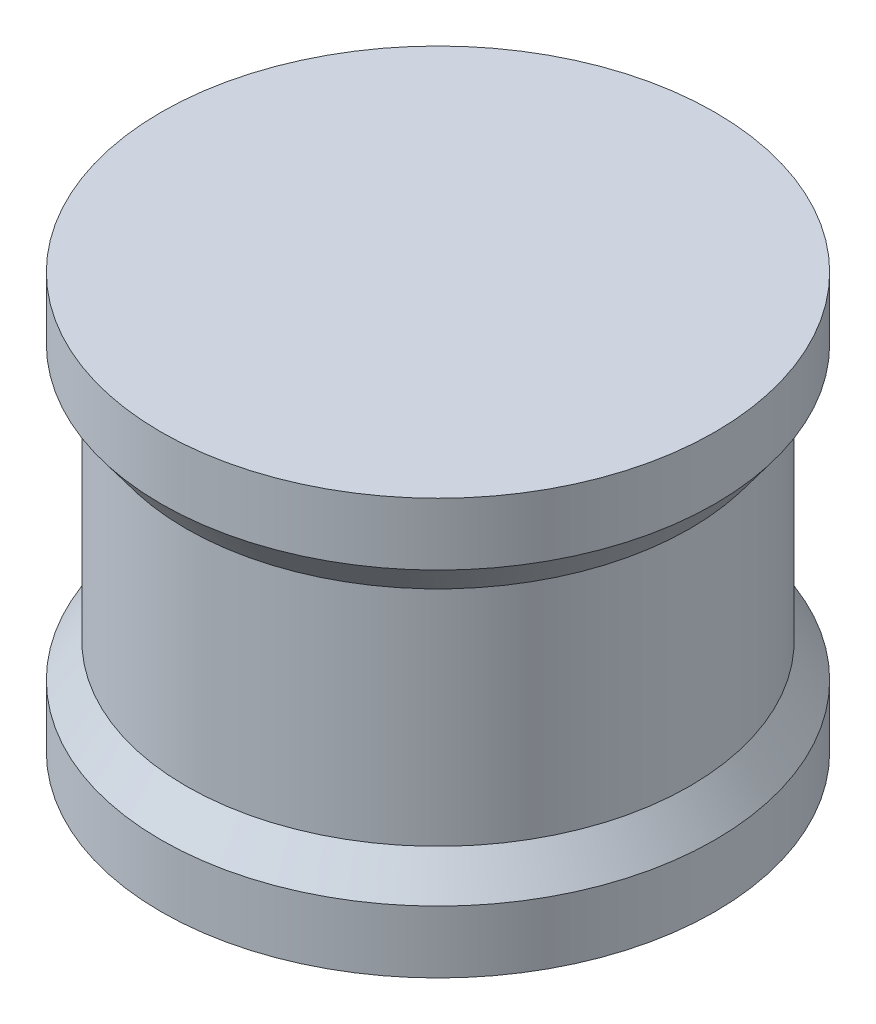
ISO-10303-21;
HEADER;
FILE_DESCRIPTION(('STEP AP214'),'2;1');
FILE_NAME('part.step','',(''),(''),'','','');
FILE_SCHEMA(('AUTOMOTIVE_DESIGN { 1 0 10303 214 1 1 1 1 }'));
ENDSEC;
DATA;
#1=APPLICATION_CONTEXT('core data for automotive mechanical design processes');
#2=APPLICATION_PROTOCOL_DEFINITION('international standard','automotive_design',2000,#1);
#3=PRODUCT_CONTEXT('',#1,'mechanical');
#4=PRODUCT('Part','Part','',(#3));
#5=PRODUCT_RELATED_PRODUCT_CATEGORY('part','',(#4));
#6=PRODUCT_DEFINITION_FORMATION('','',#4);
#7=PRODUCT_DEFINITION_CONTEXT('part definition',#1,'design');
#8=PRODUCT_DEFINITION('design','',#6,#7);
#9=PRODUCT_DEFINITION_SHAPE('','',#8);
#10=(LENGTH_UNIT() NAMED_UNIT(*) SI_UNIT(.MILLI.,.METRE.));
#11=(NAMED_UNIT(*) PLANE_ANGLE_UNIT() SI_UNIT($,.RADIAN.));
#12=(NAMED_UNIT(*) SI_UNIT($,.STERADIAN.) SOLID_ANGLE_UNIT());
#13=UNCERTAINTY_MEASURE_WITH_UNIT(LENGTH_MEASURE(1.E-05),#10,'distance_accuracy_value','');
#14=(GEOMETRIC_REPRESENTATION_CONTEXT(3) GLOBAL_UNCERTAINTY_ASSIGNED_CONTEXT((#13)) GLOBAL_UNIT_ASSIGNED_CONTEXT((#10,
#11,#12)) REPRESENTATION_CONTEXT('',''));
#15=CARTESIAN_POINT('',(0.,0.,0.));
#16=DIRECTION('',(0.,0.,1.));
#17=DIRECTION('',(1.,0.,0.));
#18=AXIS2_PLACEMENT_3D('',#15,#16,#17);
#19=CARTESIAN_POINT('',(0.,30.,0.));
#20=DIRECTION('',(0.,-1.,0.));
#21=DIRECTION('',(0.,0.,-1.));
#22=AXIS2_PLACEMENT_3D('',#19,#20,#21);
#23=CYLINDRICAL_SURFACE('',#22,20.);
#24=CARTESIAN_POINT('',(0.,4.49294523123254,0.));
#25=DIRECTION('',(0.,1.,0.));
#26=DIRECTION('',(0.,0.,1.));
#27=AXIS2_PLACEMENT_3D('',#24,#25,#26);
#28=CIRCLE('',#27,20.);
#29=CARTESIAN_POINT('',(0.,4.49294523123254,20.));
#30=VERTEX_POINT('',#29);
#31=EDGE_CURVE('E45',#30,#30,#28,.T.);
#32=ORIENTED_EDGE('',*,*,#31,.F.);
#33=EDGE_LOOP('',(#32));
#34=FACE_BOUND('',#33,.T.);
#35=CARTESIAN_POINT('',(0.,0.,0.));
#36=DIRECTION('',(0.,1.,0.));
#37=DIRECTION('',(0.,0.,1.));
#38=AXIS2_PLACEMENT_3D('',#35,#36,#37);
#39=CIRCLE('',#38,20.);
#40=CARTESIAN_POINT('',(0.,0.,20.));
#41=VERTEX_POINT('',#40);
#42=EDGE_CURVE('E38',#41,#41,#39,.T.);
#43=ORIENTED_EDGE('',*,*,#42,.T.);
#44=EDGE_LOOP('',(#43));
#45=FACE_BOUND('',#44,.T.);
#46=ADVANCED_FACE('F34',(#34,#45),#23,.T.);
#47=CARTESIAN_POINT('',(0.,0.,0.));
#48=DIRECTION('',(0.,1.,0.));
#49=DIRECTION('',(0.,0.,1.));
#50=AXIS2_PLACEMENT_3D('',#47,#48,#49);
#51=PLANE('',#50);
#52=ORIENTED_EDGE('',*,*,#42,.F.);
#53=EDGE_LOOP('',(#52));
#54=FACE_BOUND('',#53,.T.);
#55=ADVANCED_FACE('F77',(#54),#51,.F.);
#56=CARTESIAN_POINT('',(0.,4.49294523123254,0.));
#57=DIRECTION('',(0.,-1.,0.));
#58=DIRECTION('',(0.,0.,-1.));
#59=AXIS2_PLACEMENT_3D('',#56,#57,#58);
#60=CONICAL_SURFACE('',#59,20.,0.635409544931934);
#61=CARTESIAN_POINT('',(0.,6.95055760781179,0.));
#62=DIRECTION('',(0.,1.,0.));
#63=DIRECTION('',(0.,0.,1.));
#64=AXIS2_PLACEMENT_3D('',#61,#62,#63);
#65=CIRCLE('',#64,18.1876757223315);
#66=CARTESIAN_POINT('',(0.,6.95055760781179,18.1876757223315));
#67=VERTEX_POINT('',#66);
#68=EDGE_CURVE('E49',#67,#67,#65,.T.);
#69=ORIENTED_EDGE('',*,*,#68,.F.);
#70=EDGE_LOOP('',(#69));
#71=FACE_BOUND('',#70,.T.);
#72=ORIENTED_EDGE('',*,*,#31,.T.);
#73=EDGE_LOOP('',(#72));
#74=FACE_BOUND('',#73,.T.);
#75=ADVANCED_FACE('F71',(#71,#74),#60,.T.);
#76=CARTESIAN_POINT('',(0.,30.,0.));
#77=DIRECTION('',(0.,1.,0.));
#78=DIRECTION('',(0.,0.,1.));
#79=AXIS2_PLACEMENT_3D('',#76,#77,#78);
#80=CYLINDRICAL_SURFACE('',#79,18.1876757223315);
#81=CARTESIAN_POINT('',(0.,23.0494423921882,0.));
#82=DIRECTION('',(0.,1.,0.));
#83=DIRECTION('',(0.,0.,1.));
#84=AXIS2_PLACEMENT_3D('',#81,#82,#83);
#85=CIRCLE('',#84,18.1876757223315);
#86=CARTESIAN_POINT('',(0.,23.0494423921882,18.1876757223315));
#87=VERTEX_POINT('',#86);
#88=EDGE_CURVE('E52',#87,#87,#85,.T.);
#89=ORIENTED_EDGE('',*,*,#88,.F.);
#90=EDGE_LOOP('',(#89));
#91=FACE_BOUND('',#90,.T.);
#92=ORIENTED_EDGE('',*,*,#68,.T.);
#93=EDGE_LOOP('',(#92));
#94=FACE_BOUND('',#93,.T.);
#95=ADVANCED_FACE('F65',(#91,#94),#80,.T.);
#96=CARTESIAN_POINT('',(0.,23.0494423921882,0.));
#97=DIRECTION('',(0.,1.,0.));
#98=DIRECTION('',(0.,0.,1.));
#99=AXIS2_PLACEMENT_3D('',#96,#97,#98);
#100=CONICAL_SURFACE('',#99,18.1876757223315,0.635409544931934);
#101=CARTESIAN_POINT('',(0.,25.5070547687675,0.));
#102=DIRECTION('',(0.,1.,0.));
#103=DIRECTION('',(0.,0.,1.));
#104=AXIS2_PLACEMENT_3D('',#101,#102,#103);
#105=CIRCLE('',#104,20.);
#106=CARTESIAN_POINT('',(0.,25.5070547687675,20.));
#107=VERTEX_POINT('',#106);
#108=EDGE_CURVE('E55',#107,#107,#105,.T.);
#109=ORIENTED_EDGE('',*,*,#108,.F.);
#110=EDGE_LOOP('',(#109));
#111=FACE_BOUND('',#110,.T.);
#112=ORIENTED_EDGE('',*,*,#88,.T.);
#113=EDGE_LOOP('',(#112));
#114=FACE_BOUND('',#113,.T.);
#115=ADVANCED_FACE('F61',(#111,#114),#100,.T.);
#116=CARTESIAN_POINT('',(0.,30.,0.));
#117=DIRECTION('',(0.,1.,0.));
#118=DIRECTION('',(0.,0.,1.));
#119=AXIS2_PLACEMENT_3D('',#116,#117,#118);
#120=PLANE('',#119);
#121=CARTESIAN_POINT('',(0.,30.,0.));
#122=DIRECTION('',(0.,1.,0.));
#123=DIRECTION('',(0.,0.,1.));
#124=AXIS2_PLACEMENT_3D('',#121,#122,#123);
#125=CIRCLE('',#124,20.);
#126=CARTESIAN_POINT('',(0.,30.,20.));
#127=VERTEX_POINT('',#126);
#128=EDGE_CURVE('E10',#127,#127,#125,.T.);
#129=ORIENTED_EDGE('',*,*,#128,.T.);
#130=EDGE_LOOP('',(#129));
#131=FACE_BOUND('',#130,.T.);
#132=ADVANCED_FACE('F64',(#131),#120,.T.);
#133=ORIENTED_EDGE('',*,*,#108,.T.);
#134=EDGE_LOOP('',(#133));
#135=FACE_BOUND('',#134,.T.);
#136=ORIENTED_EDGE('',*,*,#128,.F.);
#137=EDGE_LOOP('',(#136));
#138=FACE_BOUND('',#137,.T.);
#139=ADVANCED_FACE('F36',(#135,#138),#23,.T.);
#140=CLOSED_SHELL('',(#46,#55,#75,#95,#115,#132,#139));
#141=MANIFOLD_SOLID_BREP('B2',#140);
#142=ADVANCED_BREP_SHAPE_REPRESENTATION('',(#18,#141),#14);
#143=SHAPE_DEFINITION_REPRESENTATION(#9,#142);
ENDSEC;
END-ISO-10303-21;
